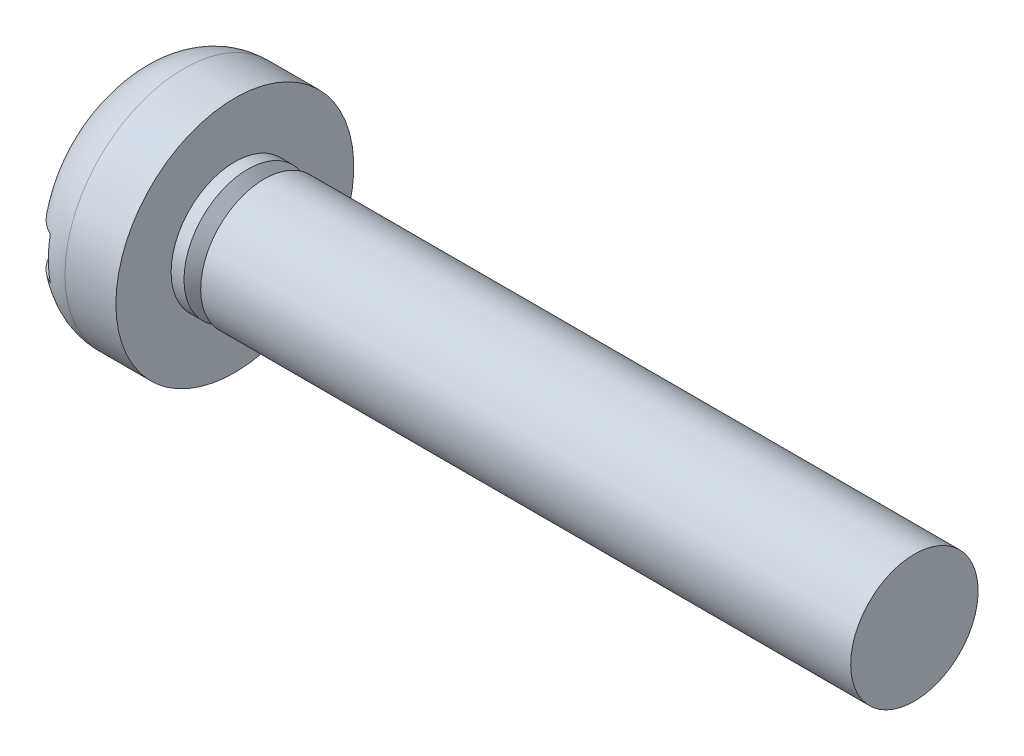
ISO-10303-21;
HEADER;
FILE_DESCRIPTION(('STEP AP214'),'2;1');
FILE_NAME('part.step','',(''),(''),'','','');
FILE_SCHEMA(('AUTOMOTIVE_DESIGN { 1 0 10303 214 1 1 1 1 }'));
ENDSEC;
DATA;
#1=APPLICATION_CONTEXT('core data for automotive mechanical design processes');
#2=APPLICATION_PROTOCOL_DEFINITION('international standard','automotive_design',2000,#1);
#3=PRODUCT_CONTEXT('',#1,'mechanical');
#4=PRODUCT('Part','Part','',(#3));
#5=PRODUCT_RELATED_PRODUCT_CATEGORY('part','',(#4));
#6=PRODUCT_DEFINITION_FORMATION('','',#4);
#7=PRODUCT_DEFINITION_CONTEXT('part definition',#1,'design');
#8=PRODUCT_DEFINITION('design','',#6,#7);
#9=PRODUCT_DEFINITION_SHAPE('','',#8);
#10=(LENGTH_UNIT() NAMED_UNIT(*) SI_UNIT(.MILLI.,.METRE.));
#11=(NAMED_UNIT(*) PLANE_ANGLE_UNIT() SI_UNIT($,.RADIAN.));
#12=(NAMED_UNIT(*) SI_UNIT($,.STERADIAN.) SOLID_ANGLE_UNIT());
#13=UNCERTAINTY_MEASURE_WITH_UNIT(LENGTH_MEASURE(1.E-05),#10,'distance_accuracy_value','');
#14=(GEOMETRIC_REPRESENTATION_CONTEXT(3) GLOBAL_UNCERTAINTY_ASSIGNED_CONTEXT((#13)) GLOBAL_UNIT_ASSIGNED_CONTEXT((#10,
#11,#12)) REPRESENTATION_CONTEXT('',''));
#15=CARTESIAN_POINT('',(0.,0.,0.));
#16=DIRECTION('',(0.,0.,1.));
#17=DIRECTION('',(1.,0.,0.));
#18=AXIS2_PLACEMENT_3D('',#15,#16,#17);
#19=CARTESIAN_POINT('',(0.,0.,0.));
#20=DIRECTION('',(-1.,0.,0.));
#21=DIRECTION('',(0.,0.,1.));
#22=AXIS2_PLACEMENT_3D('',#19,#20,#21);
#23=PLANE('',#22);
#24=DIRECTION('',(0.,0.,-1.));
#25=VECTOR('',#24,1.);
#26=CARTESIAN_POINT('',(0.,0.499999999999999,2.8));
#27=LINE('',#26,#25);
#28=CARTESIAN_POINT('',(0.,0.499999999999999,1.51986841535707));
#29=VERTEX_POINT('',#28);
#30=CARTESIAN_POINT('',(0.,0.499999999999999,-1.51986841535707));
#31=VERTEX_POINT('',#30);
#32=EDGE_CURVE('E86',#29,#31,#27,.T.);
#33=ORIENTED_EDGE('',*,*,#32,.F.);
#34=CARTESIAN_POINT('',(0.,0.,0.));
#35=DIRECTION('',(-1.,0.,0.));
#36=DIRECTION('',(0.,0.,1.));
#37=AXIS2_PLACEMENT_3D('',#34,#35,#36);
#38=CIRCLE('',#37,1.6);
#39=EDGE_CURVE('E92',#29,#31,#38,.T.);
#40=ORIENTED_EDGE('',*,*,#39,.T.);
#41=EDGE_LOOP('',(#33,#40));
#42=FACE_BOUND('',#41,.T.);
#43=ADVANCED_FACE('F31',(#42),#23,.T.);
#44=CARTESIAN_POINT('',(-25.4,0.,0.));
#45=DIRECTION('',(-1.,0.,0.));
#46=DIRECTION('',(0.,0.,1.));
#47=AXIS2_PLACEMENT_3D('',#44,#45,#46);
#48=CYLINDRICAL_SURFACE('',#47,1.5);
#49=CARTESIAN_POINT('',(2.70359178553217,0.,0.));
#50=DIRECTION('',(-1.,0.,0.));
#51=DIRECTION('',(0.,-1.,0.));
#52=AXIS2_PLACEMENT_3D('',#49,#50,#51);
#53=CIRCLE('',#52,1.5);
#54=CARTESIAN_POINT('',(2.70359178553217,-1.5,0.));
#55=VERTEX_POINT('',#54);
#56=EDGE_CURVE('E234',#55,#55,#53,.T.);
#57=ORIENTED_EDGE('',*,*,#56,.T.);
#58=EDGE_LOOP('',(#57));
#59=FACE_BOUND('',#58,.T.);
#60=CARTESIAN_POINT('',(2.4,0.,0.));
#61=DIRECTION('',(-1.,0.,0.));
#62=DIRECTION('',(0.,0.,1.));
#63=AXIS2_PLACEMENT_3D('',#60,#61,#62);
#64=CIRCLE('',#63,1.5);
#65=CARTESIAN_POINT('',(2.4,0.,1.5));
#66=VERTEX_POINT('',#65);
#67=EDGE_CURVE('E243',#66,#66,#64,.T.);
#68=ORIENTED_EDGE('',*,*,#67,.F.);
#69=EDGE_LOOP('',(#68));
#70=FACE_BOUND('',#69,.T.);
#71=ADVANCED_FACE('F33',(#59,#70),#48,.T.);
#72=DIRECTION('',(0.,0.,1.));
#73=VECTOR('',#72,1.);
#74=CARTESIAN_POINT('',(0.,-0.5,-2.8));
#75=LINE('',#74,#73);
#76=CARTESIAN_POINT('',(0.,-0.5,-1.51986841535707));
#77=VERTEX_POINT('',#76);
#78=CARTESIAN_POINT('',(0.,-0.5,1.51986841535707));
#79=VERTEX_POINT('',#78);
#80=EDGE_CURVE('E76',#77,#79,#75,.T.);
#81=ORIENTED_EDGE('',*,*,#80,.F.);
#82=EDGE_CURVE('E84',#77,#79,#38,.T.);
#83=ORIENTED_EDGE('',*,*,#82,.T.);
#84=EDGE_LOOP('',(#81,#83));
#85=FACE_BOUND('',#84,.T.);
#86=ADVANCED_FACE('F83',(#85),#23,.T.);
#87=CARTESIAN_POINT('',(1.2,0.,0.));
#88=DIRECTION('',(-1.,0.,0.));
#89=DIRECTION('',(0.,0.,1.));
#90=AXIS2_PLACEMENT_3D('',#87,#88,#89);
#91=TOROIDAL_SURFACE('',#90,1.6,1.2);
#92=CARTESIAN_POINT('',(0.72041684766873,0.499999999999999,0.));
#93=CARTESIAN_POINT('',(0.720412048939508,0.499999999999999,-0.0146788740653841));
#94=CARTESIAN_POINT('',(0.718900005058831,0.499999999999999,-0.0293743594013432));
#95=CARTESIAN_POINT('',(0.713196307760753,0.499999999999999,-0.058231455814231));
#96=CARTESIAN_POINT('',(0.70899753685826,0.499999999999999,-0.0723915427094958));
#97=CARTESIAN_POINT('',(0.69330921928297,0.499999999999999,-0.114409956528255));
#98=CARTESIAN_POINT('',(0.678789372523946,0.499999999999999,-0.141083554094181));
#99=CARTESIAN_POINT('',(0.654531172520265,0.499999999999999,-0.179480038766701));
#100=CARTESIAN_POINT('',(0.64597198681721,0.499999999999999,-0.19208180971111));
#101=CARTESIAN_POINT('',(0.628292913598717,0.499999999999999,-0.216887429916749));
#102=CARTESIAN_POINT('',(0.619173500677628,0.499999999999999,-0.229091602945127));
#103=CARTESIAN_POINT('',(0.589289095424516,0.499999999999999,-0.26795557002229));
#104=CARTESIAN_POINT('',(0.567877930367359,0.499999999999999,-0.294103724211993));
#105=CARTESIAN_POINT('',(0.524697591731285,0.499999999999999,-0.346107254729755));
#106=CARTESIAN_POINT('',(0.502928300356857,0.499999999999999,-0.371962529802982));
#107=CARTESIAN_POINT('',(0.459655347950256,0.499999999999999,-0.423933246090861));
#108=CARTESIAN_POINT('',(0.438151900919435,0.499999999999999,-0.450048869763738));
#109=CARTESIAN_POINT('',(0.395850370311965,0.499999999999999,-0.502843464044939));
#110=CARTESIAN_POINT('',(0.37505224737316,0.499999999999999,-0.529522403080942));
#111=CARTESIAN_POINT('',(0.314676040664316,0.499999999999999,-0.61007210829738));
#112=CARTESIAN_POINT('',(0.276572324816923,0.499999999999999,-0.665077713879402));
#113=CARTESIAN_POINT('',(0.206203592683604,0.499999999999999,-0.778740644765398));
#114=CARTESIAN_POINT('',(0.173935767455779,0.499999999999999,-0.837396194900194));
#115=CARTESIAN_POINT('',(0.128287337150021,0.499999999999999,-0.933666416052299));
#116=CARTESIAN_POINT('',(0.112552905260524,0.499999999999999,-0.970171571088393));
#117=CARTESIAN_POINT('',(0.0839111916245848,0.499999999999999,-1.04425975002068));
#118=CARTESIAN_POINT('',(0.0710031664681987,0.499999999999999,-1.08184248753957));
#119=CARTESIAN_POINT('',(0.0367430152837865,0.499999999999999,-1.19641692259306));
#120=CARTESIAN_POINT('',(0.0200305388466392,0.499999999999999,-1.27487203855223));
#121=CARTESIAN_POINT('',(0.000420190334344222,0.499999999999999,-1.43378681315726));
#122=CARTESIAN_POINT('',(-0.0024285284371076,0.499999999999999,-1.51425258889329));
#123=CARTESIAN_POINT('',(0.00661043116228573,0.499999999999999,-1.67422853423746));
#124=CARTESIAN_POINT('',(0.0184657642441809,0.499999999999999,-1.75374041423125));
#125=CARTESIAN_POINT('',(0.0555278787310448,0.499999999999999,-1.90338096962154));
#126=CARTESIAN_POINT('',(0.0796877212883721,0.499999999999999,-1.97376952814819));
#127=CARTESIAN_POINT('',(0.140216328828208,0.499999999999999,-2.10913652108437));
#128=CARTESIAN_POINT('',(0.176587875171219,0.499999999999999,-2.17411371878066));
#129=CARTESIAN_POINT('',(0.258067772942598,0.499999999999999,-2.2927962247864));
#130=CARTESIAN_POINT('',(0.302540901549772,0.499999999999999,-2.34693847070911));
#131=CARTESIAN_POINT('',(0.400179741623293,0.499999999999999,-2.44670054764759));
#132=CARTESIAN_POINT('',(0.45334237355792,0.499999999999999,-2.49232338568599));
#133=CARTESIAN_POINT('',(0.565184949122119,0.499999999999999,-2.57243232600358));
#134=CARTESIAN_POINT('',(0.623663828630748,0.499999999999999,-2.60719940609084));
#135=CARTESIAN_POINT('',(0.745694220862899,0.499999999999999,-2.66625915000867));
#136=CARTESIAN_POINT('',(0.809245467302626,0.499999999999999,-2.69055236325725));
#137=CARTESIAN_POINT('',(0.938633102660382,0.499999999999999,-2.72764405658332));
#138=CARTESIAN_POINT('',(1.00442390217032,0.499999999999999,-2.74060172315222));
#139=CARTESIAN_POINT('',(1.13724772188343,0.499999999999999,-2.75521752081298));
#140=CARTESIAN_POINT('',(1.20428067923609,0.499999999999999,-2.75687622205126));
#141=CARTESIAN_POINT('',(1.3372794750946,0.499999999999999,-2.74886793643813));
#142=CARTESIAN_POINT('',(1.403249224736,0.499999999999999,-2.73926569433156));
#143=CARTESIAN_POINT('',(1.53264139185227,0.499999999999999,-2.70913046977358));
#144=CARTESIAN_POINT('',(1.59606383061132,0.499999999999999,-2.68859757867419));
#145=CARTESIAN_POINT('',(1.71863223909568,0.499999999999999,-2.63719087997371));
#146=CARTESIAN_POINT('',(1.77777442017147,0.499999999999999,-2.60630804406283));
#147=CARTESIAN_POINT('',(1.89008423301932,0.499999999999999,-2.53512232010586));
#148=CARTESIAN_POINT('',(1.94325177051494,0.499999999999999,-2.49481928344532));
#149=CARTESIAN_POINT('',(2.04255909435001,0.499999999999999,-2.40563500760032));
#150=CARTESIAN_POINT('',(2.08864234450719,0.499999999999999,-2.35669084676905));
#151=CARTESIAN_POINT('',(2.17209200053389,0.499999999999999,-2.25186921229388));
#152=CARTESIAN_POINT('',(2.20945791884896,0.499999999999999,-2.19599135112043));
#153=CARTESIAN_POINT('',(2.27511560846888,0.499999999999999,-2.07792920658491));
#154=CARTESIAN_POINT('',(2.3032474621704,0.499999999999999,-2.01565607078026));
#155=CARTESIAN_POINT('',(2.34899520801393,0.499999999999999,-1.88737199408464));
#156=CARTESIAN_POINT('',(2.36661046744992,0.499999999999999,-1.82136082856549));
#157=CARTESIAN_POINT('',(2.39149402495405,0.499999999999999,-1.68532415521335));
#158=CARTESIAN_POINT('',(2.3984273556723,0.499999999999999,-1.61523762461024));
#159=CARTESIAN_POINT('',(2.40109497664014,0.499999999999999,-1.47486434156238));
#160=CARTESIAN_POINT('',(2.39682671941826,0.499999999999999,-1.40457754720463));
#161=CARTESIAN_POINT('',(2.37713279979807,0.499999999999999,-1.26144173670874));
#162=CARTESIAN_POINT('',(2.36107376853664,0.499999999999999,-1.18868087017306));
#163=CARTESIAN_POINT('',(2.31827392385858,0.499999999999999,-1.04643271957748));
#164=CARTESIAN_POINT('',(2.29153334587576,0.499999999999999,-0.976945363403338));
#165=CARTESIAN_POINT('',(2.22820539287414,0.499999999999999,-0.84064245715384));
#166=CARTESIAN_POINT('',(2.19139843567052,0.499999999999999,-0.773930118415722));
#167=CARTESIAN_POINT('',(2.13068854224588,0.499999999999999,-0.677424257840038));
#168=CARTESIAN_POINT('',(2.10953107287893,0.499999999999999,-0.645844100637232));
#169=CARTESIAN_POINT('',(2.06570120900229,0.499999999999999,-0.583751653446698));
#170=CARTESIAN_POINT('',(2.04302881931027,0.499999999999999,-0.553239360063473));
#171=CARTESIAN_POINT('',(1.99340521821559,0.499999999999999,-0.489029187138705));
#172=CARTESIAN_POINT('',(1.96629026133338,0.499999999999999,-0.455459230725904));
#173=CARTESIAN_POINT('',(1.91132292854594,0.499999999999999,-0.388899905487892));
#174=CARTESIAN_POINT('',(1.88346999390993,0.499999999999999,-0.355911009982001));
#175=CARTESIAN_POINT('',(1.83308026695125,0.499999999999999,-0.295284186504684));
#176=CARTESIAN_POINT('',(1.8104635841661,0.499999999999999,-0.267716541678259));
#177=CARTESIAN_POINT('',(1.77794009380942,0.499999999999999,-0.225293845552099));
#178=CARTESIAN_POINT('',(1.767337145573,0.499999999999999,-0.210981344273625));
#179=CARTESIAN_POINT('',(1.74696819768196,0.499999999999999,-0.181778671923871));
#180=CARTESIAN_POINT('',(1.73720145292034,0.499999999999999,-0.166889032674402));
#181=CARTESIAN_POINT('',(1.72010709727075,0.499999999999999,-0.13800707106951));
#182=CARTESIAN_POINT('',(1.712628328218,0.499999999999999,-0.124106262410802));
#183=CARTESIAN_POINT('',(1.69943337726662,0.499999999999999,-0.0954858696223195));
#184=CARTESIAN_POINT('',(1.69371380414093,0.499999999999999,-0.0807679262114248));
#185=CARTESIAN_POINT('',(1.68568215352058,0.499999999999999,-0.0532047089196466));
#186=CARTESIAN_POINT('',(1.68294676600996,0.499999999999999,-0.0404875605955899));
#187=CARTESIAN_POINT('',(1.67971179374222,0.499999999999999,-0.0147761045897463));
#188=CARTESIAN_POINT('',(1.679208749399,0.499999999999999,-0.00178225715223606));
#189=CARTESIAN_POINT('',(1.68052751446952,0.499999999999999,0.0240807898149127));
#190=CARTESIAN_POINT('',(1.68234942039452,0.499999999999999,0.0369499841477181));
#191=CARTESIAN_POINT('',(1.68799369097616,0.499999999999999,0.0622348744201114));
#192=CARTESIAN_POINT('',(1.69181840323146,0.499999999999999,0.0746500198345438));
#193=CARTESIAN_POINT('',(1.70698999961761,0.499999999999999,0.115031156907216));
#194=CARTESIAN_POINT('',(1.72157783274789,0.499999999999999,0.141731770213576));
#195=CARTESIAN_POINT('',(1.74592839004143,0.499999999999999,0.180173151206165));
#196=CARTESIAN_POINT('',(1.75451879947986,0.499999999999999,0.192792979841026));
#197=CARTESIAN_POINT('',(1.77225759281336,0.499999999999999,0.217635884242738));
#198=CARTESIAN_POINT('',(1.78140548818848,0.499999999999999,0.229859293394743));
#199=CARTESIAN_POINT('',(1.81147920129902,0.499999999999999,0.268919293629647));
#200=CARTESIAN_POINT('',(1.83305443328355,0.499999999999999,0.295240791086181));
#201=CARTESIAN_POINT('',(1.87655279228426,0.499999999999999,0.347599299139098));
#202=CARTESIAN_POINT('',(1.89847603142056,0.499999999999999,0.373636213292061));
#203=CARTESIAN_POINT('',(1.94204057295625,0.499999999999999,0.425983889530875));
#204=CARTESIAN_POINT('',(1.96368165035009,0.499999999999999,0.452294843267013));
#205=CARTESIAN_POINT('',(2.00623731232458,0.499999999999999,0.505496002556906));
#206=CARTESIAN_POINT('',(2.0271519385794,0.499999999999999,0.532386174738901));
#207=CARTESIAN_POINT('',(2.08782941410375,0.499999999999999,0.613578444151795));
#208=CARTESIAN_POINT('',(2.1260825941872,0.499999999999999,0.669039313584394));
#209=CARTESIAN_POINT('',(2.19662769211264,0.499999999999999,0.78366795540077));
#210=CARTESIAN_POINT('',(2.22892250726316,0.499999999999999,0.842833907308244));
#211=CARTESIAN_POINT('',(2.27433720539791,0.499999999999999,0.93959816879794));
#212=CARTESIAN_POINT('',(2.28988245443489,0.499999999999999,0.976065458152802));
#213=CARTESIAN_POINT('',(2.31814855286635,0.499999999999999,1.05006359532528));
#214=CARTESIAN_POINT('',(2.33087017043676,0.499999999999999,1.08759415073788));
#215=CARTESIAN_POINT('',(2.36458078861166,0.499999999999999,1.20199565103401));
#216=CARTESIAN_POINT('',(2.38093837262561,0.499999999999999,1.28030678270962));
#217=CARTESIAN_POINT('',(2.39988602839576,0.499999999999999,1.43886366458166));
#218=CARTESIAN_POINT('',(2.40242863431004,0.499999999999999,1.5191151343134));
#219=CARTESIAN_POINT('',(2.39285159877032,0.499999999999999,1.67861196744441));
#220=CARTESIAN_POINT('',(2.3807645635136,0.499999999999999,1.75785917192644));
#221=CARTESIAN_POINT('',(2.34330506107202,0.499999999999999,1.9071039053804));
#222=CARTESIAN_POINT('',(2.31894880228202,0.499999999999999,1.97735702229634));
#223=CARTESIAN_POINT('',(2.25806039890908,0.499999999999999,2.11242449895831));
#224=CARTESIAN_POINT('',(2.22152526656089,0.499999999999999,2.17723751923132));
#225=CARTESIAN_POINT('',(2.13974578708623,0.499999999999999,2.29560898573648));
#226=CARTESIAN_POINT('',(2.09512953554045,0.499999999999999,2.3496021826923));
#227=CARTESIAN_POINT('',(1.99723402551204,0.499999999999999,2.44904515707668));
#228=CARTESIAN_POINT('',(1.94395785390334,0.499999999999999,2.49449796637003));
#229=CARTESIAN_POINT('',(1.83191413875708,0.499999999999999,2.57426407833577));
#230=CARTESIAN_POINT('',(1.77334556280327,0.499999999999999,2.60885712496768));
#231=CARTESIAN_POINT('',(1.65116710151605,0.499999999999999,2.66755709093573));
#232=CARTESIAN_POINT('',(1.58755747460754,0.499999999999999,2.69166454739559));
#233=CARTESIAN_POINT('',(1.4580808832147,0.499999999999999,2.72838322048084));
#234=CARTESIAN_POINT('',(1.39225876799648,0.499999999999999,2.74115273974037));
#235=CARTESIAN_POINT('',(1.2594045710187,0.499999999999999,2.75539037676582));
#236=CARTESIAN_POINT('',(1.19237255007847,0.499999999999999,2.75685906102297));
#237=CARTESIAN_POINT('',(1.05940346375888,0.499999999999999,2.74847545994303));
#238=CARTESIAN_POINT('',(0.993462347879376,0.499999999999999,2.73868721980733));
#239=CARTESIAN_POINT('',(0.864158103249606,0.499999999999999,2.7081880445563));
#240=CARTESIAN_POINT('',(0.800794951922055,0.499999999999999,2.68747720512103));
#241=CARTESIAN_POINT('',(0.678370479735451,0.499999999999999,2.63572637335811));
#242=CARTESIAN_POINT('',(0.619313200240904,0.499999999999999,2.60467682575729));
#243=CARTESIAN_POINT('',(0.507199198586921,0.499999999999999,2.53317465528856));
#244=CARTESIAN_POINT('',(0.454142588140714,0.499999999999999,2.49272185740508));
#245=CARTESIAN_POINT('',(0.355077249684661,0.499999999999999,2.40325528669787));
#246=CARTESIAN_POINT('',(0.309125718656815,0.499999999999999,2.35417821234406));
#247=CARTESIAN_POINT('',(0.225959213511863,0.499999999999999,2.24911537813823));
#248=CARTESIAN_POINT('',(0.188744650086518,0.499999999999999,2.19312929370845));
#249=CARTESIAN_POINT('',(0.123403665927947,0.499999999999999,2.07487127102566));
#250=CARTESIAN_POINT('',(0.0954381869494443,0.499999999999999,2.01251049073106));
#251=CARTESIAN_POINT('',(0.0500327139610145,0.499999999999999,1.88407806773542));
#252=CARTESIAN_POINT('',(0.0325936609499457,0.499999999999999,1.81800609385302));
#253=CARTESIAN_POINT('',(0.00807035990082924,0.499999999999999,1.68186325964088));
#254=CARTESIAN_POINT('',(0.00132324003230871,0.499999999999999,1.61173192382516));
#255=CARTESIAN_POINT('',(-0.000970280303894637,0.499999999999999,1.47130443774604));
#256=CARTESIAN_POINT('',(0.00348501772386949,0.499999999999999,1.40100826410458));
#257=CARTESIAN_POINT('',(0.023559292288201,0.499999999999999,1.25786082286282));
#258=CARTESIAN_POINT('',(0.0398144549230251,0.499999999999999,1.18509978035494));
#259=CARTESIAN_POINT('',(0.082997915456431,0.499999999999999,1.04286773055198));
#260=CARTESIAN_POINT('',(0.109927504517466,0.499999999999999,0.973397122401281));
#261=CARTESIAN_POINT('',(0.174231842447243,0.499999999999999,0.835839235617502));
#262=CARTESIAN_POINT('',(0.212007827232689,0.499999999999999,0.767941604175749));
#263=CARTESIAN_POINT('',(0.274324681432985,0.499999999999999,0.669793476577844));
#264=CARTESIAN_POINT('',(0.296044427243775,0.499999999999999,0.637687270178575));
#265=CARTESIAN_POINT('',(0.341021418948149,0.499999999999999,0.57456811284161));
#266=CARTESIAN_POINT('',(0.364278656860981,0.499999999999999,0.543555156230399));
#267=CARTESIAN_POINT('',(0.421715763032551,0.499999999999999,0.469890356624288));
#268=CARTESIAN_POINT('',(0.456460905626268,0.499999999999999,0.427685707160354));
#269=CARTESIAN_POINT('',(0.509000463839659,0.499999999999999,0.364738970252818));
#270=CARTESIAN_POINT('',(0.526586441150703,0.499999999999999,0.34381386889151));
#271=CARTESIAN_POINT('',(0.561526271803614,0.499999999999999,0.301771093391315));
#272=CARTESIAN_POINT('',(0.57888016902059,0.499999999999999,0.280653456958263));
#273=CARTESIAN_POINT('',(0.611350030781705,0.499999999999999,0.239542801354447));
#274=CARTESIAN_POINT('',(0.626532079116186,0.499999999999999,0.219602337861267));
#275=CARTESIAN_POINT('',(0.655363349770272,0.499999999999999,0.178585081603407));
#276=CARTESIAN_POINT('',(0.669012907341329,0.499999999999999,0.15750853886931));
#277=CARTESIAN_POINT('',(0.688713433221145,0.499999999999999,0.121364952057716));
#278=CARTESIAN_POINT('',(0.695736483057814,0.499999999999999,0.106842871182119));
#279=CARTESIAN_POINT('',(0.707567025834741,0.499999999999999,0.0769323774269456));
#280=CARTESIAN_POINT('',(0.712383603956176,0.499999999999999,0.0615478152271337));
#281=CARTESIAN_POINT('',(0.717195405704469,0.499999999999999,0.0383063341291171));
#282=CARTESIAN_POINT('',(0.718395303280937,0.499999999999999,0.0306962694113904));
#283=CARTESIAN_POINT('',(0.720007304426348,0.499999999999999,0.015392329214771));
#284=CARTESIAN_POINT('',(0.720419364399414,0.499999999999999,0.00769844912155146));
#285=CARTESIAN_POINT('',(0.72041684766873,0.499999999999999,0.));
#286=B_SPLINE_CURVE_WITH_KNOTS('',3,(#92,#93,#94,#95,#96,#97,#98,#99,#100,#101,#102,#103,#104,
#105,#106,#107,#108,#109,#110,#111,#112,#113,#114,#115,#116,#117,#118,#119,#120,#121,#122,#123,
#124,#125,#126,#127,#128,#129,#130,#131,#132,#133,#134,#135,#136,#137,#138,#139,#140,#141,#142,
#143,#144,#145,#146,#147,#148,#149,#150,#151,#152,#153,#154,#155,#156,#157,#158,#159,#160,#161,
#162,#163,#164,#165,#166,#167,#168,#169,#170,#171,#172,#173,#174,#175,#176,#177,#178,#179,#180,
#181,#182,#183,#184,#185,#186,#187,#188,#189,#190,#191,#192,#193,#194,#195,#196,#197,#198,#199,
#200,#201,#202,#203,#204,#205,#206,#207,#208,#209,#210,#211,#212,#213,#214,#215,#216,#217,#218,
#219,#220,#221,#222,#223,#224,#225,#226,#227,#228,#229,#230,#231,#232,#233,#234,#235,#236,#237,
#238,#239,#240,#241,#242,#243,#244,#245,#246,#247,#248,#249,#250,#251,#252,#253,#254,#255,#256,
#257,#258,#259,#260,#261,#262,#263,#264,#265,#266,#267,#268,#269,#270,#271,#272,#273,#274,#275,
#276,#277,#278,#279,#280,#281,#282,#283,#284,#285),.UNSPECIFIED.,.T.,.F.,(4,2,2,2,2,2,2,2,2,2,2,
2,2,2,2,2,2,2,2,2,2,2,2,2,2,2,2,2,2,2,2,2,2,2,2,2,2,2,2,2,2,2,2,2,2,2,2,2,2,2,2,2,2,2,2,2,2,2,2,
2,2,2,2,2,2,2,2,2,2,2,2,2,2,2,2,2,2,2,2,2,2,2,2,2,2,2,2,2,2,2,2,2,2,2,2,2,4),(0.,
0.0440007777412295,0.0881186045072458,0.178439883605831,0.224162667229452,0.269847237288858,
0.371215673713097,0.472618146887272,0.574097532607891,0.675571245698367,0.876045230357626,
1.07642246420038,1.19557056112831,1.31468728162281,1.5541167205877,1.79439443006587,
2.03414452398768,2.25624817905149,2.47840245521464,2.6875667392036,2.89665705613685,
3.09977266560001,3.30287761911755,3.50308231786229,3.70327691419207,3.90232611273858,
4.10137364777365,4.30059526689211,4.49982002917178,4.7005602805569,4.90131175651788,
5.10537604680917,5.30945261290896,5.51980706790486,5.73020936597509,5.95282679378428,
6.17543931511552,6.40335976126921,6.51736063431675,6.63136114484167,6.76079428687679,
6.89032839433737,6.99726917064708,7.0506896731056,7.10406206826355,7.15134355971998,
7.19853332630829,7.23739190284068,7.27619023700197,7.31499018177746,7.35383570822755,
7.44431654217284,7.49013797501691,7.53591981675864,7.63800298964586,7.7401197472806,
7.8423134884784,7.94450135743416,8.14634438291872,8.34808900024174,8.46690950349511,
8.58569764160656,8.8244900860689,9.06410246310416,9.30318177972335,9.52509515660859,
9.74706301419919,9.95615575991307,10.1651741362094,10.3682553552594,10.5713261702607,
10.7715149375741,10.9716936697071,11.1707391146127,11.369782815944,11.5690109910555,
11.768242874547,11.9690033344308,12.169773229415,12.37387247664,12.577989966403,
12.7884238578574,12.9988896569375,13.2216352359058,13.4444077660678,13.6768112621125,
13.7930633594116,13.9093148533215,14.0732787980665,14.1552836637652,14.2372728006865,
14.3124424153825,14.387595553615,14.4358843891865,14.4839725669983,14.5070478386021,
14.5301243870649),.UNSPECIFIED.);
#287=CARTESIAN_POINT('',(0.7,0.499999999999999,-2.6440098102472));
#288=VERTEX_POINT('',#287);
#289=EDGE_CURVE('E11',#31,#288,#286,.T.);
#290=ORIENTED_EDGE('',*,*,#289,.F.);
#291=ORIENTED_EDGE('',*,*,#39,.F.);
#292=CARTESIAN_POINT('',(0.7,0.499999999999999,2.6440098102472));
#293=VERTEX_POINT('',#292);
#294=EDGE_CURVE('E35',#293,#29,#286,.T.);
#295=ORIENTED_EDGE('',*,*,#294,.F.);
#296=CARTESIAN_POINT('',(0.7,0.,0.));
#297=DIRECTION('',(-1.,0.,0.));
#298=DIRECTION('',(0.,0.,1.));
#299=AXIS2_PLACEMENT_3D('',#296,#297,#298);
#300=CIRCLE('',#299,2.69087121146357);
#301=CARTESIAN_POINT('',(0.7,-0.5,2.6440098102472));
#302=VERTEX_POINT('',#301);
#303=EDGE_CURVE('E104',#293,#302,#300,.F.);
#304=ORIENTED_EDGE('',*,*,#303,.T.);
#305=CARTESIAN_POINT('',(0.720416847668728,-0.5,0.));
#306=CARTESIAN_POINT('',(0.720412048939506,-0.5,0.0146788740653842));
#307=CARTESIAN_POINT('',(0.718900005058829,-0.5,0.0293743594013435));
#308=CARTESIAN_POINT('',(0.713196307760751,-0.5,0.0582314558142315));
#309=CARTESIAN_POINT('',(0.708997536858258,-0.5,0.0723915427094964));
#310=CARTESIAN_POINT('',(0.693309219282968,-0.5,0.114409956528256));
#311=CARTESIAN_POINT('',(0.678789372523943,-0.5,0.141083554094182));
#312=CARTESIAN_POINT('',(0.654531172520262,-0.5,0.179480038766702));
#313=CARTESIAN_POINT('',(0.645971986817206,-0.5,0.192081809711112));
#314=CARTESIAN_POINT('',(0.628292913598714,-0.5,0.216887429916751));
#315=CARTESIAN_POINT('',(0.619173500677624,-0.5,0.229091602945129));
#316=CARTESIAN_POINT('',(0.589289095424512,-0.5,0.267955570022292));
#317=CARTESIAN_POINT('',(0.567877930367355,-0.5,0.294103724211996));
#318=CARTESIAN_POINT('',(0.52469759173128,-0.5,0.346107254729759));
#319=CARTESIAN_POINT('',(0.502928300356852,-0.5,0.371962529802987));
#320=CARTESIAN_POINT('',(0.459655347950251,-0.5,0.423933246090867));
#321=CARTESIAN_POINT('',(0.43815190091943,-0.5,0.450048869763743));
#322=CARTESIAN_POINT('',(0.395850370311959,-0.5,0.502843464044946));
#323=CARTESIAN_POINT('',(0.375052247373154,-0.5,0.529522403080948));
#324=CARTESIAN_POINT('',(0.314676040664309,-0.5,0.610072108297388));
#325=CARTESIAN_POINT('',(0.276572324816916,-0.5,0.665077713879411));
#326=CARTESIAN_POINT('',(0.206203592683597,-0.5,0.778740644765409));
#327=CARTESIAN_POINT('',(0.173935767455772,-0.5,0.837396194900206));
#328=CARTESIAN_POINT('',(0.128287337150014,-0.5,0.933666416052312));
#329=CARTESIAN_POINT('',(0.112552905260518,-0.5,0.970171571088406));
#330=CARTESIAN_POINT('',(0.08391119162458,-0.5,1.04425975002069));
#331=CARTESIAN_POINT('',(0.0710031664681945,-0.5,1.08184248753958));
#332=CARTESIAN_POINT('',(0.0367430152837836,-0.5,1.19641692259307));
#333=CARTESIAN_POINT('',(0.0200305388466369,-0.5,1.27487203855225));
#334=CARTESIAN_POINT('',(0.000420190334343312,-0.5,1.43378681315727));
#335=CARTESIAN_POINT('',(-0.00242852843710769,-0.5,1.51425258889331));
#336=CARTESIAN_POINT('',(0.00661043116228707,-0.5,1.67422853423747));
#337=CARTESIAN_POINT('',(0.0184657642441829,-0.5,1.75374041423126));
#338=CARTESIAN_POINT('',(0.0555278787310478,-0.5,1.90338096962155));
#339=CARTESIAN_POINT('',(0.0796877212883754,-0.5,1.9737695281482));
#340=CARTESIAN_POINT('',(0.140216328828212,-0.5,2.10913652108438));
#341=CARTESIAN_POINT('',(0.176587875171224,-0.5,2.17411371878067));
#342=CARTESIAN_POINT('',(0.258067772942604,-0.5,2.29279622478641));
#343=CARTESIAN_POINT('',(0.302540901549779,-0.5,2.34693847070912));
#344=CARTESIAN_POINT('',(0.400179741623301,-0.5,2.4467005476476));
#345=CARTESIAN_POINT('',(0.453342373557928,-0.5,2.492323385686));
#346=CARTESIAN_POINT('',(0.565184949122127,-0.5,2.57243232600358));
#347=CARTESIAN_POINT('',(0.623663828630756,-0.5,2.60719940609084));
#348=CARTESIAN_POINT('',(0.745694220862907,-0.5,2.66625915000868));
#349=CARTESIAN_POINT('',(0.809245467302634,-0.5,2.69055236325726));
#350=CARTESIAN_POINT('',(0.938633102660391,-0.5,2.72764405658332));
#351=CARTESIAN_POINT('',(1.00442390217033,-0.5,2.74060172315222));
#352=CARTESIAN_POINT('',(1.13724772188344,-0.5,2.75521752081298));
#353=CARTESIAN_POINT('',(1.2042806792361,-0.5,2.75687622205126));
#354=CARTESIAN_POINT('',(1.33727947509461,-0.5,2.74886793643813));
#355=CARTESIAN_POINT('',(1.403249224736,-0.5,2.73926569433155));
#356=CARTESIAN_POINT('',(1.53264139185228,-0.5,2.70913046977358));
#357=CARTESIAN_POINT('',(1.59606383061133,-0.5,2.68859757867419));
#358=CARTESIAN_POINT('',(1.71863223909569,-0.5,2.63719087997371));
#359=CARTESIAN_POINT('',(1.77777442017148,-0.5,2.60630804406283));
#360=CARTESIAN_POINT('',(1.89008423301933,-0.5,2.53512232010585));
#361=CARTESIAN_POINT('',(1.94325177051495,-0.5,2.49481928344531));
#362=CARTESIAN_POINT('',(2.04255909435002,-0.5,2.40563500760031));
#363=CARTESIAN_POINT('',(2.08864234450719,-0.5,2.35669084676904));
#364=CARTESIAN_POINT('',(2.17209200053389,-0.5,2.25186921229387));
#365=CARTESIAN_POINT('',(2.20945791884896,-0.5,2.19599135112042));
#366=CARTESIAN_POINT('',(2.27511560846888,-0.5,2.0779292065849));
#367=CARTESIAN_POINT('',(2.3032474621704,-0.5,2.01565607078025));
#368=CARTESIAN_POINT('',(2.34899520801394,-0.5,1.88737199408463));
#369=CARTESIAN_POINT('',(2.36661046744993,-0.5,1.82136082856548));
#370=CARTESIAN_POINT('',(2.39149402495405,-0.5,1.68532415521334));
#371=CARTESIAN_POINT('',(2.3984273556723,-0.5,1.61523762461023));
#372=CARTESIAN_POINT('',(2.40109497664014,-0.5,1.47486434156237));
#373=CARTESIAN_POINT('',(2.39682671941826,-0.5,1.40457754720462));
#374=CARTESIAN_POINT('',(2.37713279979807,-0.5,1.26144173670873));
#375=CARTESIAN_POINT('',(2.36107376853663,-0.5,1.18868087017305));
#376=CARTESIAN_POINT('',(2.31827392385858,-0.5,1.04643271957747));
#377=CARTESIAN_POINT('',(2.29153334587575,-0.5,0.976945363403328));
#378=CARTESIAN_POINT('',(2.22820539287413,-0.5,0.840642457153826));
#379=CARTESIAN_POINT('',(2.19139843567051,-0.5,0.773930118415705));
#380=CARTESIAN_POINT('',(2.13068854224586,-0.5,0.677424257840015));
#381=CARTESIAN_POINT('',(2.10953107287891,-0.5,0.645844100637208));
#382=CARTESIAN_POINT('',(2.06570120900227,-0.5,0.58375165344667));
#383=CARTESIAN_POINT('',(2.04302881931025,-0.5,0.553239360063443));
#384=CARTESIAN_POINT('',(1.99340521821557,-0.5,0.489029187138675));
#385=CARTESIAN_POINT('',(1.96629026133336,-0.5,0.455459230725875));
#386=CARTESIAN_POINT('',(1.91132292854592,-0.5,0.388899905487864));
#387=CARTESIAN_POINT('',(1.8834699939099,-0.5,0.355911009981974));
#388=CARTESIAN_POINT('',(1.83308026695122,-0.5,0.295284186504649));
#389=CARTESIAN_POINT('',(1.81046358416607,-0.5,0.267716541678216));
#390=CARTESIAN_POINT('',(1.77794009380938,-0.5,0.225293845552044));
#391=CARTESIAN_POINT('',(1.76733714557296,-0.5,0.210981344273565));
#392=CARTESIAN_POINT('',(1.74696819768191,-0.5,0.181778671923801));
#393=CARTESIAN_POINT('',(1.73720145292029,-0.5,0.166889032674327));
#394=CARTESIAN_POINT('',(1.72010709727071,-0.5,0.138007071069431));
#395=CARTESIAN_POINT('',(1.71262832821796,-0.5,0.124106262410724));
#396=CARTESIAN_POINT('',(1.69943337726659,-0.5,0.0954858696222442));
#397=CARTESIAN_POINT('',(1.69371380414091,-0.5,0.0807679262113511));
#398=CARTESIAN_POINT('',(1.68568215352056,-0.5,0.0532047089195756));
#399=CARTESIAN_POINT('',(1.68294676600995,-0.5,0.0404875605955195));
#400=CARTESIAN_POINT('',(1.67971179374222,-0.5,0.0147761045896779));
#401=CARTESIAN_POINT('',(1.679208749399,-0.5,0.00178225715216884));
#402=CARTESIAN_POINT('',(1.68052751446953,-0.5,-0.0240807898149765));
#403=CARTESIAN_POINT('',(1.68234942039453,-0.5,-0.0369499841477796));
#404=CARTESIAN_POINT('',(1.68799369097618,-0.5,-0.0622348744201683));
#405=CARTESIAN_POINT('',(1.69181840323148,-0.5,-0.0746500198345982));
#406=CARTESIAN_POINT('',(1.70698999961764,-0.5,-0.115031156907286));
#407=CARTESIAN_POINT('',(1.72157783274794,-0.5,-0.141731770213663));
#408=CARTESIAN_POINT('',(1.74592839004151,-0.5,-0.180173151206276));
#409=CARTESIAN_POINT('',(1.75451879947995,-0.5,-0.192792979841146));
#410=CARTESIAN_POINT('',(1.77225759281346,-0.5,-0.217635884242874));
#411=CARTESIAN_POINT('',(1.78140548818859,-0.5,-0.229859293394887));
#412=CARTESIAN_POINT('',(1.81147920129916,-0.5,-0.268919293629822));
#413=CARTESIAN_POINT('',(1.83305443328371,-0.5,-0.29524079108638));
#414=CARTESIAN_POINT('',(1.87655279228447,-0.5,-0.347599299139347));
#415=CARTESIAN_POINT('',(1.8984760314208,-0.5,-0.373636213292335));
#416=CARTESIAN_POINT('',(1.94204057295652,-0.5,-0.425983889531202));
#417=CARTESIAN_POINT('',(1.96368165035038,-0.5,-0.452294843267368));
#418=CARTESIAN_POINT('',(2.0062373123249,-0.5,-0.505496002557318));
#419=CARTESIAN_POINT('',(2.02715193857974,-0.5,-0.532386174739342));
#420=CARTESIAN_POINT('',(2.08782941410413,-0.5,-0.613578444152326));
#421=CARTESIAN_POINT('',(2.1260825941876,-0.5,-0.66903931358499));
#422=CARTESIAN_POINT('',(2.19662769211306,-0.5,-0.783667955401502));
#423=CARTESIAN_POINT('',(2.22892250726358,-0.5,-0.842833907309049));
#424=CARTESIAN_POINT('',(2.27433720539829,-0.5,-0.939598168798815));
#425=CARTESIAN_POINT('',(2.28988245443525,-0.5,-0.976065458153671));
#426=CARTESIAN_POINT('',(2.31814855286665,-0.5,-1.05006359532613));
#427=CARTESIAN_POINT('',(2.33087017043703,-0.5,-1.08759415073873));
#428=CARTESIAN_POINT('',(2.36458078861185,-0.5,-1.20199565103483));
#429=CARTESIAN_POINT('',(2.38093837262575,-0.5,-1.28030678271042));
#430=CARTESIAN_POINT('',(2.39988602839581,-0.5,-1.43886366458241));
#431=CARTESIAN_POINT('',(2.40242863431004,-0.5,-1.51911513431412));
#432=CARTESIAN_POINT('',(2.39285159877024,-0.5,-1.67861196744506));
#433=CARTESIAN_POINT('',(2.38076456351348,-0.5,-1.75785917192705));
#434=CARTESIAN_POINT('',(2.34330506107184,-0.5,-1.90710390538095));
#435=CARTESIAN_POINT('',(2.31894880228181,-0.5,-1.97735702229687));
#436=CARTESIAN_POINT('',(2.25806039890882,-0.5,-2.1124244989588));
#437=CARTESIAN_POINT('',(2.22152526656061,-0.5,-2.17723751923179));
#438=CARTESIAN_POINT('',(2.13974578708591,-0.5,-2.2956089857369));
#439=CARTESIAN_POINT('',(2.0951295355401,-0.5,-2.3496021826927));
#440=CARTESIAN_POINT('',(1.99723402551165,-0.5,-2.44904515707703));
#441=CARTESIAN_POINT('',(1.94395785390294,-0.5,-2.49449796637036));
#442=CARTESIAN_POINT('',(1.83191413875664,-0.5,-2.57426407833604));
#443=CARTESIAN_POINT('',(1.77334556280282,-0.5,-2.60885712496792));
#444=CARTESIAN_POINT('',(1.65116710151558,-0.5,-2.66755709093592));
#445=CARTESIAN_POINT('',(1.58755747460706,-0.5,-2.69166454739576));
#446=CARTESIAN_POINT('',(1.45808088321421,-0.5,-2.72838322048095));
#447=CARTESIAN_POINT('',(1.39225876799598,-0.5,-2.74115273974045));
#448=CARTESIAN_POINT('',(1.2594045710182,-0.5,-2.75539037676584));
#449=CARTESIAN_POINT('',(1.19237255007796,-0.5,-2.75685906102297));
#450=CARTESIAN_POINT('',(1.05940346375838,-0.5,-2.74847545994297));
#451=CARTESIAN_POINT('',(0.993462347878883,-0.5,-2.73868721980725));
#452=CARTESIAN_POINT('',(0.864158103249127,-0.5,-2.70818804455616));
#453=CARTESIAN_POINT('',(0.800794951921584,-0.5,-2.68747720512086));
#454=CARTESIAN_POINT('',(0.678370479735002,-0.5,-2.63572637335789));
#455=CARTESIAN_POINT('',(0.619313200240468,-0.5,-2.60467682575705));
#456=CARTESIAN_POINT('',(0.507199198586514,-0.5,-2.53317465528827));
#457=CARTESIAN_POINT('',(0.454142588140324,-0.5,-2.49272185740477));
#458=CARTESIAN_POINT('',(0.355077249684307,-0.5,-2.40325528669751));
#459=CARTESIAN_POINT('',(0.30912571865648,-0.5,-2.35417821234368));
#460=CARTESIAN_POINT('',(0.225959213511571,-0.5,-2.24911537813782));
#461=CARTESIAN_POINT('',(0.188744650086249,-0.5,-2.19312929370802));
#462=CARTESIAN_POINT('',(0.123403665927725,-0.5,-2.0748712710252));
#463=CARTESIAN_POINT('',(0.0954381869492479,-0.5,-2.01251049073059));
#464=CARTESIAN_POINT('',(0.0500327139608694,-0.5,-1.88407806773493));
#465=CARTESIAN_POINT('',(0.0325936609498268,-0.5,-1.81800609385252));
#466=CARTESIAN_POINT('',(0.00807035990076453,-0.5,-1.68186325964036));
#467=CARTESIAN_POINT('',(0.0013232400322721,-0.5,-1.61173192382464));
#468=CARTESIAN_POINT('',(-0.000970280303875131,-0.5,-1.47130443774551));
#469=CARTESIAN_POINT('',(0.00348501772391706,-0.5,-1.40100826410405));
#470=CARTESIAN_POINT('',(0.0235592922883056,-0.5,-1.25786082286228));
#471=CARTESIAN_POINT('',(0.0398144549231591,-0.5,-1.1850997803544));
#472=CARTESIAN_POINT('',(0.0829979154566226,-0.5,-1.04286773055144));
#473=CARTESIAN_POINT('',(0.109927504517686,-0.5,-0.973397122400748));
#474=CARTESIAN_POINT('',(0.174231842447614,-0.5,-0.835839235616773));
#475=CARTESIAN_POINT('',(0.212007827233211,-0.5,-0.767941604174835));
#476=CARTESIAN_POINT('',(0.274324681433758,-0.5,-0.669793476576672));
#477=CARTESIAN_POINT('',(0.296044427244637,-0.5,-0.637687270177319));
#478=CARTESIAN_POINT('',(0.341021418949191,-0.5,-0.574568112840193));
#479=CARTESIAN_POINT('',(0.364278656862115,-0.5,-0.543555156228904));
#480=CARTESIAN_POINT('',(0.421715763033664,-0.5,-0.469890356622914));
#481=CARTESIAN_POINT('',(0.456460905627253,-0.5,-0.427685707159166));
#482=CARTESIAN_POINT('',(0.509000463840431,-0.5,-0.364738970251896));
#483=CARTESIAN_POINT('',(0.526586441151401,-0.5,-0.343813868890674));
#484=CARTESIAN_POINT('',(0.561526271804161,-0.5,-0.301771093390649));
#485=CARTESIAN_POINT('',(0.57888016902106,-0.5,-0.28065345695768));
#486=CARTESIAN_POINT('',(0.611350030782065,-0.5,-0.239542801353978));
#487=CARTESIAN_POINT('',(0.62653207911651,-0.5,-0.219602337860827));
#488=CARTESIAN_POINT('',(0.655363349770523,-0.5,-0.178585081603024));
#489=CARTESIAN_POINT('',(0.669012907341543,-0.5,-0.157508538868956));
#490=CARTESIAN_POINT('',(0.688713433221302,-0.5,-0.121364952057402));
#491=CARTESIAN_POINT('',(0.695736483057951,-0.5,-0.106842871181814));
#492=CARTESIAN_POINT('',(0.707567025834834,-0.5,-0.0769323774266611));
#493=CARTESIAN_POINT('',(0.712383603956246,-0.5,-0.0615478152268602));
#494=CARTESIAN_POINT('',(0.717195405704503,-0.5,-0.0383063341288994));
#495=CARTESIAN_POINT('',(0.718395303280958,-0.5,-0.0306962694112161));
#496=CARTESIAN_POINT('',(0.720007304426351,-0.5,-0.0153923292146838));
#497=CARTESIAN_POINT('',(0.720419364399412,-0.5,-0.0076984491215078));
#498=CARTESIAN_POINT('',(0.720416847668728,-0.5,0.));
#499=B_SPLINE_CURVE_WITH_KNOTS('',3,(#305,#306,#307,#308,#309,#310,#311,#312,#313,#314,#315,
#316,#317,#318,#319,#320,#321,#322,#323,#324,#325,#326,#327,#328,#329,#330,#331,#332,#333,#334,
#335,#336,#337,#338,#339,#340,#341,#342,#343,#344,#345,#346,#347,#348,#349,#350,#351,#352,#353,
#354,#355,#356,#357,#358,#359,#360,#361,#362,#363,#364,#365,#366,#367,#368,#369,#370,#371,#372,
#373,#374,#375,#376,#377,#378,#379,#380,#381,#382,#383,#384,#385,#386,#387,#388,#389,#390,#391,
#392,#393,#394,#395,#396,#397,#398,#399,#400,#401,#402,#403,#404,#405,#406,#407,#408,#409,#410,
#411,#412,#413,#414,#415,#416,#417,#418,#419,#420,#421,#422,#423,#424,#425,#426,#427,#428,#429,
#430,#431,#432,#433,#434,#435,#436,#437,#438,#439,#440,#441,#442,#443,#444,#445,#446,#447,#448,
#449,#450,#451,#452,#453,#454,#455,#456,#457,#458,#459,#460,#461,#462,#463,#464,#465,#466,#467,
#468,#469,#470,#471,#472,#473,#474,#475,#476,#477,#478,#479,#480,#481,#482,#483,#484,#485,#486,
#487,#488,#489,#490,#491,#492,#493,#494,#495,#496,#497,#498),.UNSPECIFIED.,.T.,.F.,(4,2,2,2,2,2,
2,2,2,2,2,2,2,2,2,2,2,2,2,2,2,2,2,2,2,2,2,2,2,2,2,2,2,2,2,2,2,2,2,2,2,2,2,2,2,2,2,2,2,2,2,2,2,2,
2,2,2,2,2,2,2,2,2,2,2,2,2,2,2,2,2,2,2,2,2,2,2,2,2,2,2,2,2,2,2,2,2,2,2,2,2,2,2,2,2,2,4),(0.,
0.0440007777412297,0.0881186045072466,0.178439883605833,0.224162667229454,0.26984723728886,
0.371215673713101,0.472618146887277,0.574097532607898,0.675571245698375,0.876045230357637,
1.0764224642004,1.19557056112832,1.31468728162282,1.55411672058771,1.79439443006588,
2.03414452398769,2.2562481790515,2.47840245521465,2.68756673920361,2.89665705613686,
3.09977266560001,3.30287761911756,3.5030823178623,3.70327691419208,3.90232611273859,
4.10137364777366,4.30059526689212,4.49982002917179,4.70056028055691,4.90131175651788,
5.10537604680918,5.30945261290896,5.51980706790487,5.7302093659751,5.95282679378429,
6.17543931511553,6.40335976126923,6.51736063431678,6.63136114484171,6.76079428687683,
6.8903283943374,6.99726917064714,7.05068967310568,7.10406206826364,7.15134355972006,
7.19853332630836,7.23739190284074,7.27619023700203,7.31499018177752,7.35383570822761,
7.44431654217296,7.49013797501706,7.53591981675883,7.63800298964614,7.74011974728098,
7.84231348847888,7.94450135743475,8.14634438291949,8.3480890002427,8.46690950349603,
8.58569764160744,8.82449008606968,9.06410246310485,9.30318177972394,9.52509515660915,
9.74706301419973,9.95615575991359,10.1651741362099,10.3682553552599,10.5713261702612,
10.7715149375746,10.9716936697076,11.1707391146132,11.3697828159445,11.569010991056,
11.7682428745475,11.9690033344313,12.1697732294155,12.3738724766405,12.5779899664035,
12.7884238578579,12.9988896569381,13.2216352359064,13.4444077660684,13.6768112621137,
13.7930633594133,13.9093148533235,14.0732787980678,14.1552836637661,14.2372728006871,
14.312442415383,14.3875955536153,14.4358843891868,14.4839725669986,14.5070478386022,
14.5301243870649),.UNSPECIFIED.);
#500=EDGE_CURVE('E80',#79,#302,#499,.T.);
#501=ORIENTED_EDGE('',*,*,#500,.F.);
#502=ORIENTED_EDGE('',*,*,#82,.F.);
#503=CARTESIAN_POINT('',(0.7,-0.5,-2.6440098102472));
#504=VERTEX_POINT('',#503);
#505=EDGE_CURVE('E44',#504,#77,#499,.T.);
#506=ORIENTED_EDGE('',*,*,#505,.F.);
#507=EDGE_CURVE('E56',#504,#288,#300,.F.);
#508=ORIENTED_EDGE('',*,*,#507,.T.);
#509=EDGE_LOOP('',(#290,#291,#295,#304,#501,#502,#506,#508));
#510=FACE_BOUND('',#509,.T.);
#511=CARTESIAN_POINT('',(1.2,0.,0.));
#512=DIRECTION('',(-1.,0.,0.));
#513=DIRECTION('',(0.,0.,1.));
#514=AXIS2_PLACEMENT_3D('',#511,#512,#513);
#515=CIRCLE('',#514,2.8);
#516=CARTESIAN_POINT('',(1.2,0.,2.8));
#517=VERTEX_POINT('',#516);
#518=EDGE_CURVE('E93',#517,#517,#515,.T.);
#519=ORIENTED_EDGE('',*,*,#518,.T.);
#520=EDGE_LOOP('',(#519));
#521=FACE_BOUND('',#520,.T.);
#522=ADVANCED_FACE('F89',(#510,#521),#91,.T.);
#523=CARTESIAN_POINT('',(-25.4,0.,0.));
#524=DIRECTION('',(-1.,0.,0.));
#525=DIRECTION('',(0.,0.,1.));
#526=AXIS2_PLACEMENT_3D('',#523,#524,#525);
#527=CYLINDRICAL_SURFACE('',#526,2.8);
#528=CARTESIAN_POINT('',(2.4,0.,0.));
#529=DIRECTION('',(-1.,0.,0.));
#530=DIRECTION('',(0.,0.,1.));
#531=AXIS2_PLACEMENT_3D('',#528,#529,#530);
#532=CIRCLE('',#531,2.8);
#533=CARTESIAN_POINT('',(2.4,0.,2.8));
#534=VERTEX_POINT('',#533);
#535=EDGE_CURVE('E98',#534,#534,#532,.T.);
#536=ORIENTED_EDGE('',*,*,#535,.T.);
#537=EDGE_LOOP('',(#536));
#538=FACE_BOUND('',#537,.T.);
#539=ORIENTED_EDGE('',*,*,#518,.F.);
#540=EDGE_LOOP('',(#539));
#541=FACE_BOUND('',#540,.T.);
#542=ADVANCED_FACE('F123',(#538,#541),#527,.T.);
#543=CARTESIAN_POINT('',(2.4,1.5,0.));
#544=DIRECTION('',(-1.,0.,0.));
#545=DIRECTION('',(0.,0.,1.));
#546=AXIS2_PLACEMENT_3D('',#543,#544,#545);
#547=PLANE('',#546);
#548=ORIENTED_EDGE('',*,*,#535,.F.);
#549=EDGE_LOOP('',(#548));
#550=FACE_BOUND('',#549,.T.);
#551=ORIENTED_EDGE('',*,*,#67,.T.);
#552=EDGE_LOOP('',(#551));
#553=FACE_BOUND('',#552,.T.);
#554=ADVANCED_FACE('F120',(#550,#553),#547,.F.);
#555=CARTESIAN_POINT('',(0.7,0.499999999999999,2.8));
#556=DIRECTION('',(0.,1.,0.));
#557=DIRECTION('',(0.,0.,1.));
#558=AXIS2_PLACEMENT_3D('',#555,#556,#557);
#559=PLANE('',#558);
#560=ORIENTED_EDGE('',*,*,#289,.T.);
#561=DIRECTION('',(0.,0.,-1.));
#562=VECTOR('',#561,1.);
#563=CARTESIAN_POINT('',(0.7,0.499999999999999,2.8));
#564=LINE('',#563,#562);
#565=EDGE_CURVE('E85',#293,#288,#564,.T.);
#566=ORIENTED_EDGE('',*,*,#565,.F.);
#567=ORIENTED_EDGE('',*,*,#294,.T.);
#568=ORIENTED_EDGE('',*,*,#32,.T.);
#569=EDGE_LOOP('',(#560,#566,#567,#568));
#570=FACE_BOUND('',#569,.T.);
#571=ADVANCED_FACE('F115',(#570),#559,.F.);
#572=CARTESIAN_POINT('',(0.7,-0.5,-2.8));
#573=DIRECTION('',(0.,-1.,0.));
#574=DIRECTION('',(0.,0.,-1.));
#575=AXIS2_PLACEMENT_3D('',#572,#573,#574);
#576=PLANE('',#575);
#577=ORIENTED_EDGE('',*,*,#500,.T.);
#578=DIRECTION('',(0.,0.,1.));
#579=VECTOR('',#578,1.);
#580=CARTESIAN_POINT('',(0.7,-0.5,-2.8));
#581=LINE('',#580,#579);
#582=EDGE_CURVE('E51',#504,#302,#581,.T.);
#583=ORIENTED_EDGE('',*,*,#582,.F.);
#584=ORIENTED_EDGE('',*,*,#505,.T.);
#585=ORIENTED_EDGE('',*,*,#80,.T.);
#586=EDGE_LOOP('',(#577,#583,#584,#585));
#587=FACE_BOUND('',#586,.T.);
#588=ADVANCED_FACE('F75',(#587),#576,.F.);
#589=CARTESIAN_POINT('',(0.7,0.499999999999999,-2.8));
#590=DIRECTION('',(-1.,0.,0.));
#591=DIRECTION('',(0.,0.,1.));
#592=AXIS2_PLACEMENT_3D('',#589,#590,#591);
#593=PLANE('',#592);
#594=ORIENTED_EDGE('',*,*,#582,.T.);
#595=ORIENTED_EDGE('',*,*,#303,.F.);
#596=ORIENTED_EDGE('',*,*,#565,.T.);
#597=ORIENTED_EDGE('',*,*,#507,.F.);
#598=EDGE_LOOP('',(#594,#595,#596,#597));
#599=FACE_BOUND('',#598,.T.);
#600=ADVANCED_FACE('F114',(#599),#593,.T.);
#601=CARTESIAN_POINT('',(3.09640821446782,0.,0.));
#602=DIRECTION('',(1.,0.,0.));
#603=DIRECTION('',(0.,1.,0.));
#604=AXIS2_PLACEMENT_3D('',#601,#602,#603);
#605=CONICAL_SURFACE('',#604,1.5,0.959931088596885);
#606=CARTESIAN_POINT('',(2.9,0.,0.));
#607=DIRECTION('',(-1.,0.,0.));
#608=DIRECTION('',(0.,-1.,0.));
#609=AXIS2_PLACEMENT_3D('',#606,#607,#608);
#610=CIRCLE('',#609,1.2195);
#611=CARTESIAN_POINT('',(2.9,-1.2195,0.));
#612=VERTEX_POINT('',#611);
#613=EDGE_CURVE('E238',#612,#612,#610,.T.);
#614=ORIENTED_EDGE('',*,*,#613,.F.);
#615=EDGE_LOOP('',(#614));
#616=FACE_BOUND('',#615,.T.);
#617=CARTESIAN_POINT('',(3.09640821446782,0.,0.));
#618=DIRECTION('',(-1.,0.,0.));
#619=DIRECTION('',(0.,-1.,0.));
#620=AXIS2_PLACEMENT_3D('',#617,#618,#619);
#621=CIRCLE('',#620,1.5);
#622=CARTESIAN_POINT('',(3.09640821446782,-1.5,0.));
#623=VERTEX_POINT('',#622);
#624=EDGE_CURVE('E232',#623,#623,#621,.T.);
#625=ORIENTED_EDGE('',*,*,#624,.T.);
#626=EDGE_LOOP('',(#625));
#627=FACE_BOUND('',#626,.T.);
#628=ADVANCED_FACE('F171',(#616,#627),#605,.T.);
#629=CARTESIAN_POINT('',(2.9,0.,0.));
#630=DIRECTION('',(-1.,0.,0.));
#631=DIRECTION('',(0.,-1.,0.));
#632=AXIS2_PLACEMENT_3D('',#629,#630,#631);
#633=CONICAL_SURFACE('',#632,1.2195,0.959931088596877);
#634=ORIENTED_EDGE('',*,*,#56,.F.);
#635=EDGE_LOOP('',(#634));
#636=FACE_BOUND('',#635,.T.);
#637=ORIENTED_EDGE('',*,*,#613,.T.);
#638=EDGE_LOOP('',(#637));
#639=FACE_BOUND('',#638,.T.);
#640=ADVANCED_FACE('F186',(#636,#639),#633,.T.);
#641=CARTESIAN_POINT('',(18.4,1.5,0.));
#642=DIRECTION('',(1.,0.,0.));
#643=DIRECTION('',(0.,0.,-1.));
#644=AXIS2_PLACEMENT_3D('',#641,#642,#643);
#645=PLANE('',#644);
#646=CARTESIAN_POINT('',(18.4,0.,0.));
#647=DIRECTION('',(-1.,0.,0.));
#648=DIRECTION('',(0.,0.,1.));
#649=AXIS2_PLACEMENT_3D('',#646,#647,#648);
#650=CIRCLE('',#649,1.5);
#651=CARTESIAN_POINT('',(18.4,0.,1.5));
#652=VERTEX_POINT('',#651);
#653=EDGE_CURVE('E96',#652,#652,#650,.T.);
#654=ORIENTED_EDGE('',*,*,#653,.F.);
#655=EDGE_LOOP('',(#654));
#656=FACE_BOUND('',#655,.T.);
#657=ADVANCED_FACE('F195',(#656),#645,.T.);
#658=ORIENTED_EDGE('',*,*,#624,.F.);
#659=EDGE_LOOP('',(#658));
#660=FACE_BOUND('',#659,.T.);
#661=ORIENTED_EDGE('',*,*,#653,.T.);
#662=EDGE_LOOP('',(#661));
#663=FACE_BOUND('',#662,.T.);
#664=ADVANCED_FACE('F138',(#660,#663),#48,.T.);
#665=CLOSED_SHELL('',(#43,#71,#86,#522,#542,#554,#571,#588,#600,#628,#640,#657,#664));
#666=MANIFOLD_SOLID_BREP('B2',#665);
#667=ADVANCED_BREP_SHAPE_REPRESENTATION('',(#18,#666),#14);
#668=SHAPE_DEFINITION_REPRESENTATION(#9,#667);
ENDSEC;
END-ISO-10303-21;
